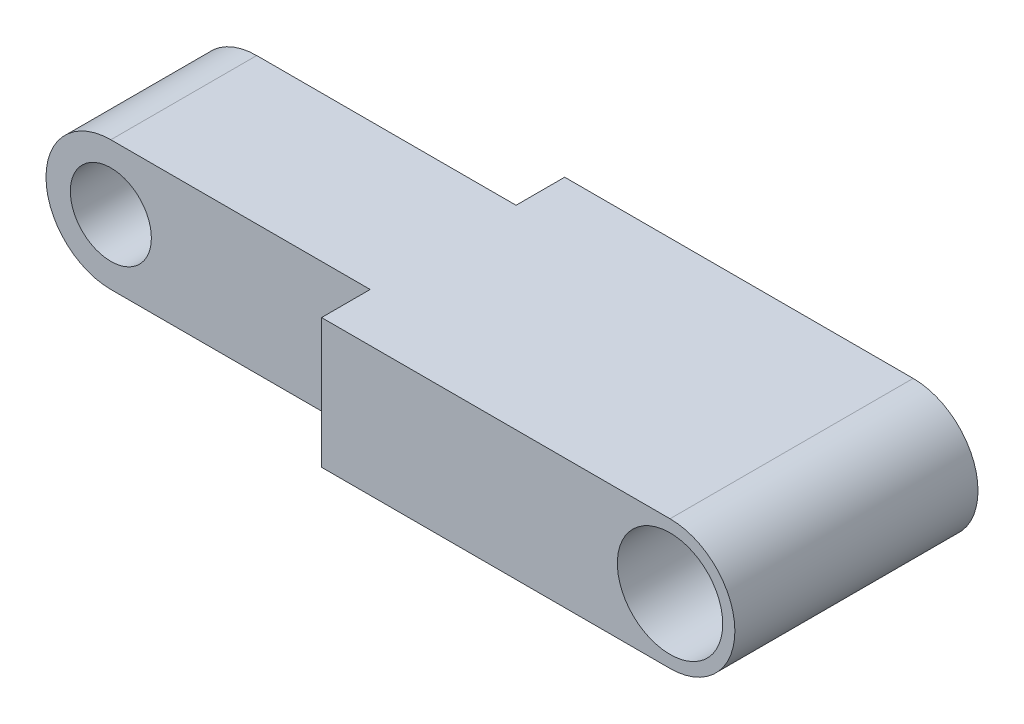
ISO-10303-21;
HEADER;
FILE_DESCRIPTION(('STEP AP214'),'2;1');
FILE_NAME('part.step','',(''),(''),'','','');
FILE_SCHEMA(('AUTOMOTIVE_DESIGN { 1 0 10303 214 1 1 1 1 }'));
ENDSEC;
DATA;
#1=APPLICATION_CONTEXT('core data for automotive mechanical design processes');
#2=APPLICATION_PROTOCOL_DEFINITION('international standard','automotive_design',2000,#1);
#3=PRODUCT_CONTEXT('',#1,'mechanical');
#4=PRODUCT('Part','Part','',(#3));
#5=PRODUCT_RELATED_PRODUCT_CATEGORY('part','',(#4));
#6=PRODUCT_DEFINITION_FORMATION('','',#4);
#7=PRODUCT_DEFINITION_CONTEXT('part definition',#1,'design');
#8=PRODUCT_DEFINITION('design','',#6,#7);
#9=PRODUCT_DEFINITION_SHAPE('','',#8);
#10=(LENGTH_UNIT() NAMED_UNIT(*) SI_UNIT(.MILLI.,.METRE.));
#11=(NAMED_UNIT(*) PLANE_ANGLE_UNIT() SI_UNIT($,.RADIAN.));
#12=(NAMED_UNIT(*) SI_UNIT($,.STERADIAN.) SOLID_ANGLE_UNIT());
#13=UNCERTAINTY_MEASURE_WITH_UNIT(LENGTH_MEASURE(1.E-05),#10,'distance_accuracy_value','');
#14=(GEOMETRIC_REPRESENTATION_CONTEXT(3) GLOBAL_UNCERTAINTY_ASSIGNED_CONTEXT((#13)) GLOBAL_UNIT_ASSIGNED_CONTEXT((#10,
#11,#12)) REPRESENTATION_CONTEXT('',''));
#15=CARTESIAN_POINT('',(0.,0.,0.));
#16=DIRECTION('',(0.,0.,1.));
#17=DIRECTION('',(1.,0.,0.));
#18=AXIS2_PLACEMENT_3D('',#15,#16,#17);
#19=CARTESIAN_POINT('',(-75.,0.,60.));
#20=DIRECTION('',(0.,0.,-1.));
#21=DIRECTION('',(-1.,0.,0.));
#22=AXIS2_PLACEMENT_3D('',#19,#20,#21);
#23=CYLINDRICAL_SURFACE('',#22,16.);
#24=CARTESIAN_POINT('',(-75.,0.,12.));
#25=DIRECTION('',(0.,0.,1.));
#26=DIRECTION('',(1.,0.,0.));
#27=AXIS2_PLACEMENT_3D('',#24,#25,#26);
#28=CIRCLE('',#27,16.);
#29=CARTESIAN_POINT('',(-75.,16.,12.));
#30=VERTEX_POINT('',#29);
#31=CARTESIAN_POINT('',(-75.,-16.,12.));
#32=VERTEX_POINT('',#31);
#33=EDGE_CURVE('E113',#30,#32,#28,.T.);
#34=ORIENTED_EDGE('',*,*,#33,.T.);
#35=DIRECTION('',(0.,0.,-1.));
#36=VECTOR('',#35,1.);
#37=CARTESIAN_POINT('',(-75.,-16.,60.));
#38=LINE('',#37,#36);
#39=CARTESIAN_POINT('',(-75.,-16.,48.));
#40=VERTEX_POINT('',#39);
#41=EDGE_CURVE('E11',#40,#32,#38,.T.);
#42=ORIENTED_EDGE('',*,*,#41,.F.);
#43=CARTESIAN_POINT('',(-75.,0.,48.));
#44=DIRECTION('',(0.,0.,1.));
#45=DIRECTION('',(1.,0.,0.));
#46=AXIS2_PLACEMENT_3D('',#43,#44,#45);
#47=CIRCLE('',#46,16.);
#48=CARTESIAN_POINT('',(-75.,16.,48.));
#49=VERTEX_POINT('',#48);
#50=EDGE_CURVE('E135',#49,#40,#47,.T.);
#51=ORIENTED_EDGE('',*,*,#50,.F.);
#52=DIRECTION('',(0.,0.,-1.));
#53=VECTOR('',#52,1.);
#54=CARTESIAN_POINT('',(-75.,16.,60.));
#55=LINE('',#54,#53);
#56=EDGE_CURVE('E167',#49,#30,#55,.T.);
#57=ORIENTED_EDGE('',*,*,#56,.T.);
#58=EDGE_LOOP('',(#34,#42,#51,#57));
#59=FACE_BOUND('',#58,.T.);
#60=ADVANCED_FACE('F35',(#59),#23,.T.);
#61=CARTESIAN_POINT('',(-75.,0.,-0.001000000000001));
#62=DIRECTION('',(0.,0.,1.));
#63=DIRECTION('',(1.,0.,0.));
#64=AXIS2_PLACEMENT_3D('',#61,#62,#63);
#65=CYLINDRICAL_SURFACE('',#64,9.99999999999999);
#66=CARTESIAN_POINT('',(-75.,0.,48.));
#67=DIRECTION('',(0.,0.,1.));
#68=DIRECTION('',(1.,0.,0.));
#69=AXIS2_PLACEMENT_3D('',#66,#67,#68);
#70=CIRCLE('',#69,9.99999999999999);
#71=CARTESIAN_POINT('',(-65.,0.,48.));
#72=VERTEX_POINT('',#71);
#73=EDGE_CURVE('E38',#72,#72,#70,.F.);
#74=ORIENTED_EDGE('',*,*,#73,.F.);
#75=EDGE_LOOP('',(#74));
#76=FACE_BOUND('',#75,.T.);
#77=CARTESIAN_POINT('',(-75.,0.,12.));
#78=DIRECTION('',(0.,0.,-1.));
#79=DIRECTION('',(-1.,0.,0.));
#80=AXIS2_PLACEMENT_3D('',#77,#78,#79);
#81=CIRCLE('',#80,9.99999999999999);
#82=CARTESIAN_POINT('',(-85.,0.,12.));
#83=VERTEX_POINT('',#82);
#84=EDGE_CURVE('E125',#83,#83,#81,.F.);
#85=ORIENTED_EDGE('',*,*,#84,.F.);
#86=EDGE_LOOP('',(#85));
#87=FACE_BOUND('',#86,.T.);
#88=ADVANCED_FACE('F219',(#76,#87),#65,.F.);
#89=CARTESIAN_POINT('',(-75.,-16.,60.));
#90=DIRECTION('',(0.,1.,0.));
#91=DIRECTION('',(-1.,0.,0.));
#92=AXIS2_PLACEMENT_3D('',#89,#90,#91);
#93=PLANE('',#92);
#94=DIRECTION('',(0.,0.,-1.));
#95=VECTOR('',#94,1.);
#96=CARTESIAN_POINT('',(-11.,-16.,12.));
#97=LINE('',#96,#95);
#98=CARTESIAN_POINT('',(-11.,-16.,12.));
#99=VERTEX_POINT('',#98);
#100=CARTESIAN_POINT('',(-11.,-16.,0.));
#101=VERTEX_POINT('',#100);
#102=EDGE_CURVE('E103',#99,#101,#97,.T.);
#103=ORIENTED_EDGE('',*,*,#102,.T.);
#104=DIRECTION('',(1.,0.,0.));
#105=VECTOR('',#104,1.);
#106=CARTESIAN_POINT('',(-75.,-16.,0.));
#107=LINE('',#106,#105);
#108=CARTESIAN_POINT('',(75.,-16.,0.));
#109=VERTEX_POINT('',#108);
#110=EDGE_CURVE('E157',#101,#109,#107,.T.);
#111=ORIENTED_EDGE('',*,*,#110,.T.);
#112=DIRECTION('',(0.,0.,-1.));
#113=VECTOR('',#112,1.);
#114=CARTESIAN_POINT('',(75.,-16.,60.));
#115=LINE('',#114,#113);
#116=CARTESIAN_POINT('',(75.,-16.,60.));
#117=VERTEX_POINT('',#116);
#118=EDGE_CURVE('E43',#117,#109,#115,.T.);
#119=ORIENTED_EDGE('',*,*,#118,.F.);
#120=DIRECTION('',(1.,0.,0.));
#121=VECTOR('',#120,1.);
#122=CARTESIAN_POINT('',(-75.,-16.,60.));
#123=LINE('',#122,#121);
#124=CARTESIAN_POINT('',(-11.,-16.,60.));
#125=VERTEX_POINT('',#124);
#126=EDGE_CURVE('E160',#125,#117,#123,.T.);
#127=ORIENTED_EDGE('',*,*,#126,.F.);
#128=DIRECTION('',(0.,0.,1.));
#129=VECTOR('',#128,1.);
#130=CARTESIAN_POINT('',(-11.,-16.,48.));
#131=LINE('',#130,#129);
#132=CARTESIAN_POINT('',(-11.,-16.,48.));
#133=VERTEX_POINT('',#132);
#134=EDGE_CURVE('E58',#133,#125,#131,.T.);
#135=ORIENTED_EDGE('',*,*,#134,.F.);
#136=DIRECTION('',(1.,0.,0.));
#137=VECTOR('',#136,1.);
#138=CARTESIAN_POINT('',(-75.,-16.,48.));
#139=LINE('',#138,#137);
#140=EDGE_CURVE('E137',#40,#133,#139,.T.);
#141=ORIENTED_EDGE('',*,*,#140,.F.);
#142=ORIENTED_EDGE('',*,*,#41,.T.);
#143=DIRECTION('',(1.,0.,0.));
#144=VECTOR('',#143,1.);
#145=CARTESIAN_POINT('',(-75.,-16.,12.));
#146=LINE('',#145,#144);
#147=EDGE_CURVE('E106',#32,#99,#146,.T.);
#148=ORIENTED_EDGE('',*,*,#147,.T.);
#149=EDGE_LOOP('',(#103,#111,#119,#127,#135,#141,#142,#148));
#150=FACE_BOUND('',#149,.T.);
#151=ADVANCED_FACE('F188',(#150),#93,.F.);
#152=CARTESIAN_POINT('',(-75.,16.,60.));
#153=DIRECTION('',(0.,-1.,0.));
#154=DIRECTION('',(1.,0.,0.));
#155=AXIS2_PLACEMENT_3D('',#152,#153,#154);
#156=PLANE('',#155);
#157=DIRECTION('',(0.,0.,-1.));
#158=VECTOR('',#157,1.);
#159=CARTESIAN_POINT('',(-11.,16.,12.));
#160=LINE('',#159,#158);
#161=CARTESIAN_POINT('',(-11.,16.,12.));
#162=VERTEX_POINT('',#161);
#163=CARTESIAN_POINT('',(-11.,16.,0.));
#164=VERTEX_POINT('',#163);
#165=EDGE_CURVE('E50',#162,#164,#160,.T.);
#166=ORIENTED_EDGE('',*,*,#165,.F.);
#167=DIRECTION('',(-1.,0.,0.));
#168=VECTOR('',#167,1.);
#169=CARTESIAN_POINT('',(-11.,16.,12.));
#170=LINE('',#169,#168);
#171=EDGE_CURVE('E107',#162,#30,#170,.T.);
#172=ORIENTED_EDGE('',*,*,#171,.T.);
#173=ORIENTED_EDGE('',*,*,#56,.F.);
#174=DIRECTION('',(-1.,0.,0.));
#175=VECTOR('',#174,1.);
#176=CARTESIAN_POINT('',(-11.,16.,48.));
#177=LINE('',#176,#175);
#178=CARTESIAN_POINT('',(-11.,16.,48.));
#179=VERTEX_POINT('',#178);
#180=EDGE_CURVE('E133',#179,#49,#177,.T.);
#181=ORIENTED_EDGE('',*,*,#180,.F.);
#182=DIRECTION('',(0.,0.,1.));
#183=VECTOR('',#182,1.);
#184=CARTESIAN_POINT('',(-11.,16.,48.));
#185=LINE('',#184,#183);
#186=CARTESIAN_POINT('',(-11.,16.,60.));
#187=VERTEX_POINT('',#186);
#188=EDGE_CURVE('E143',#179,#187,#185,.T.);
#189=ORIENTED_EDGE('',*,*,#188,.T.);
#190=DIRECTION('',(-1.,0.,0.));
#191=VECTOR('',#190,1.);
#192=CARTESIAN_POINT('',(-75.,16.,60.));
#193=LINE('',#192,#191);
#194=CARTESIAN_POINT('',(75.,16.,60.));
#195=VERTEX_POINT('',#194);
#196=EDGE_CURVE('E164',#195,#187,#193,.T.);
#197=ORIENTED_EDGE('',*,*,#196,.F.);
#198=DIRECTION('',(0.,0.,-1.));
#199=VECTOR('',#198,1.);
#200=CARTESIAN_POINT('',(75.,16.,60.));
#201=LINE('',#200,#199);
#202=CARTESIAN_POINT('',(75.,16.,0.));
#203=VERTEX_POINT('',#202);
#204=EDGE_CURVE('E173',#195,#203,#201,.T.);
#205=ORIENTED_EDGE('',*,*,#204,.T.);
#206=DIRECTION('',(-1.,0.,0.));
#207=VECTOR('',#206,1.);
#208=CARTESIAN_POINT('',(-75.,16.,0.));
#209=LINE('',#208,#207);
#210=EDGE_CURVE('E123',#203,#164,#209,.T.);
#211=ORIENTED_EDGE('',*,*,#210,.T.);
#212=EDGE_LOOP('',(#166,#172,#173,#181,#189,#197,#205,#211));
#213=FACE_BOUND('',#212,.T.);
#214=ADVANCED_FACE('F120',(#213),#156,.F.);
#215=CARTESIAN_POINT('',(-75.,0.,0.));
#216=DIRECTION('',(0.,0.,1.));
#217=DIRECTION('',(1.,0.,0.));
#218=AXIS2_PLACEMENT_3D('',#215,#216,#217);
#219=PLANE('',#218);
#220=CARTESIAN_POINT('',(75.,0.,0.));
#221=DIRECTION('',(0.,0.,1.));
#222=DIRECTION('',(1.,0.,0.));
#223=AXIS2_PLACEMENT_3D('',#220,#221,#222);
#224=CIRCLE('',#223,8.25);
#225=CARTESIAN_POINT('',(83.25,0.,0.));
#226=VERTEX_POINT('',#225);
#227=EDGE_CURVE('E150',#226,#226,#224,.F.);
#228=ORIENTED_EDGE('',*,*,#227,.F.);
#229=EDGE_LOOP('',(#228));
#230=FACE_BOUND('',#229,.T.);
#231=DIRECTION('',(0.,1.,0.));
#232=VECTOR('',#231,1.);
#233=CARTESIAN_POINT('',(-11.,16.,0.));
#234=LINE('',#233,#232);
#235=EDGE_CURVE('E117',#101,#164,#234,.T.);
#236=ORIENTED_EDGE('',*,*,#235,.T.);
#237=ORIENTED_EDGE('',*,*,#210,.F.);
#238=CARTESIAN_POINT('',(75.,0.,0.));
#239=DIRECTION('',(0.,0.,1.));
#240=DIRECTION('',(1.,0.,0.));
#241=AXIS2_PLACEMENT_3D('',#238,#239,#240);
#242=CIRCLE('',#241,16.);
#243=EDGE_CURVE('E169',#109,#203,#242,.T.);
#244=ORIENTED_EDGE('',*,*,#243,.F.);
#245=ORIENTED_EDGE('',*,*,#110,.F.);
#246=EDGE_LOOP('',(#236,#237,#244,#245));
#247=FACE_BOUND('',#246,.T.);
#248=ADVANCED_FACE('F186',(#230,#247),#219,.F.);
#249=CARTESIAN_POINT('',(75.,0.,60.));
#250=DIRECTION('',(0.,0.,-1.));
#251=DIRECTION('',(-1.,0.,0.));
#252=AXIS2_PLACEMENT_3D('',#249,#250,#251);
#253=CYLINDRICAL_SURFACE('',#252,16.);
#254=ORIENTED_EDGE('',*,*,#243,.T.);
#255=ORIENTED_EDGE('',*,*,#204,.F.);
#256=CARTESIAN_POINT('',(75.,0.,60.));
#257=DIRECTION('',(0.,0.,1.));
#258=DIRECTION('',(1.,0.,0.));
#259=AXIS2_PLACEMENT_3D('',#256,#257,#258);
#260=CIRCLE('',#259,16.);
#261=EDGE_CURVE('E162',#117,#195,#260,.T.);
#262=ORIENTED_EDGE('',*,*,#261,.F.);
#263=ORIENTED_EDGE('',*,*,#118,.T.);
#264=EDGE_LOOP('',(#254,#255,#262,#263));
#265=FACE_BOUND('',#264,.T.);
#266=ADVANCED_FACE('F180',(#265),#253,.T.);
#267=CARTESIAN_POINT('',(-75.,0.,60.));
#268=DIRECTION('',(0.,0.,1.));
#269=DIRECTION('',(1.,0.,0.));
#270=AXIS2_PLACEMENT_3D('',#267,#268,#269);
#271=PLANE('',#270);
#272=DIRECTION('',(0.,1.,0.));
#273=VECTOR('',#272,1.);
#274=CARTESIAN_POINT('',(-11.,16.,60.));
#275=LINE('',#274,#273);
#276=EDGE_CURVE('E132',#125,#187,#275,.T.);
#277=ORIENTED_EDGE('',*,*,#276,.F.);
#278=ORIENTED_EDGE('',*,*,#126,.T.);
#279=ORIENTED_EDGE('',*,*,#261,.T.);
#280=ORIENTED_EDGE('',*,*,#196,.T.);
#281=EDGE_LOOP('',(#277,#278,#279,#280));
#282=FACE_BOUND('',#281,.T.);
#283=CARTESIAN_POINT('',(75.,0.,60.));
#284=DIRECTION('',(0.,0.,1.));
#285=DIRECTION('',(1.,0.,0.));
#286=AXIS2_PLACEMENT_3D('',#283,#284,#285);
#287=CIRCLE('',#286,13.);
#288=CARTESIAN_POINT('',(88.,0.,60.));
#289=VERTEX_POINT('',#288);
#290=EDGE_CURVE('E153',#289,#289,#287,.T.);
#291=ORIENTED_EDGE('',*,*,#290,.F.);
#292=EDGE_LOOP('',(#291));
#293=FACE_BOUND('',#292,.T.);
#294=ADVANCED_FACE('F200',(#282,#293),#271,.T.);
#295=CARTESIAN_POINT('',(75.,0.,35.));
#296=DIRECTION('',(0.,0.,1.));
#297=DIRECTION('',(1.,0.,0.));
#298=AXIS2_PLACEMENT_3D('',#295,#296,#297);
#299=CYLINDRICAL_SURFACE('',#298,13.);
#300=CARTESIAN_POINT('',(75.,0.,35.));
#301=DIRECTION('',(0.,0.,1.));
#302=DIRECTION('',(1.,0.,0.));
#303=AXIS2_PLACEMENT_3D('',#300,#301,#302);
#304=CIRCLE('',#303,13.);
#305=CARTESIAN_POINT('',(88.,0.,35.));
#306=VERTEX_POINT('',#305);
#307=EDGE_CURVE('E154',#306,#306,#304,.T.);
#308=ORIENTED_EDGE('',*,*,#307,.F.);
#309=EDGE_LOOP('',(#308));
#310=FACE_BOUND('',#309,.T.);
#311=ORIENTED_EDGE('',*,*,#290,.T.);
#312=EDGE_LOOP('',(#311));
#313=FACE_BOUND('',#312,.T.);
#314=ADVANCED_FACE('F203',(#310,#313),#299,.F.);
#315=CARTESIAN_POINT('',(75.,0.,35.));
#316=DIRECTION('',(0.,0.,1.));
#317=DIRECTION('',(1.,0.,0.));
#318=AXIS2_PLACEMENT_3D('',#315,#316,#317);
#319=PLANE('',#318);
#320=CARTESIAN_POINT('',(75.,0.,35.));
#321=DIRECTION('',(0.,0.,1.));
#322=DIRECTION('',(1.,0.,0.));
#323=AXIS2_PLACEMENT_3D('',#320,#321,#322);
#324=CIRCLE('',#323,8.25);
#325=CARTESIAN_POINT('',(83.25,0.,35.));
#326=VERTEX_POINT('',#325);
#327=EDGE_CURVE('E147',#326,#326,#324,.T.);
#328=ORIENTED_EDGE('',*,*,#327,.F.);
#329=EDGE_LOOP('',(#328));
#330=FACE_BOUND('',#329,.T.);
#331=ORIENTED_EDGE('',*,*,#307,.T.);
#332=EDGE_LOOP('',(#331));
#333=FACE_BOUND('',#332,.T.);
#334=ADVANCED_FACE('F208',(#330,#333),#319,.T.);
#335=CARTESIAN_POINT('',(75.,0.,-0.001000000000001));
#336=DIRECTION('',(0.,0.,1.));
#337=DIRECTION('',(1.,0.,0.));
#338=AXIS2_PLACEMENT_3D('',#335,#336,#337);
#339=CYLINDRICAL_SURFACE('',#338,8.25);
#340=ORIENTED_EDGE('',*,*,#327,.T.);
#341=EDGE_LOOP('',(#340));
#342=FACE_BOUND('',#341,.T.);
#343=ORIENTED_EDGE('',*,*,#227,.T.);
#344=EDGE_LOOP('',(#343));
#345=FACE_BOUND('',#344,.T.);
#346=ADVANCED_FACE('F214',(#342,#345),#339,.F.);
#347=CARTESIAN_POINT('',(-75.,0.,48.));
#348=DIRECTION('',(0.,0.,1.));
#349=DIRECTION('',(1.,0.,0.));
#350=AXIS2_PLACEMENT_3D('',#347,#348,#349);
#351=PLANE('',#350);
#352=ORIENTED_EDGE('',*,*,#180,.T.);
#353=ORIENTED_EDGE('',*,*,#50,.T.);
#354=ORIENTED_EDGE('',*,*,#140,.T.);
#355=DIRECTION('',(0.,1.,0.));
#356=VECTOR('',#355,1.);
#357=CARTESIAN_POINT('',(-11.,16.,48.));
#358=LINE('',#357,#356);
#359=EDGE_CURVE('E139',#133,#179,#358,.T.);
#360=ORIENTED_EDGE('',*,*,#359,.T.);
#361=EDGE_LOOP('',(#352,#353,#354,#360));
#362=FACE_BOUND('',#361,.T.);
#363=ORIENTED_EDGE('',*,*,#73,.T.);
#364=EDGE_LOOP('',(#363));
#365=FACE_BOUND('',#364,.T.);
#366=ADVANCED_FACE('F196',(#362,#365),#351,.T.);
#367=CARTESIAN_POINT('',(-11.,16.,48.));
#368=DIRECTION('',(1.,0.,0.));
#369=DIRECTION('',(0.,0.,-1.));
#370=AXIS2_PLACEMENT_3D('',#367,#368,#369);
#371=PLANE('',#370);
#372=ORIENTED_EDGE('',*,*,#276,.T.);
#373=ORIENTED_EDGE('',*,*,#188,.F.);
#374=ORIENTED_EDGE('',*,*,#359,.F.);
#375=ORIENTED_EDGE('',*,*,#134,.T.);
#376=EDGE_LOOP('',(#372,#373,#374,#375));
#377=FACE_BOUND('',#376,.T.);
#378=ADVANCED_FACE('F198',(#377),#371,.F.);
#379=CARTESIAN_POINT('',(-75.,0.,12.));
#380=DIRECTION('',(0.,0.,-1.));
#381=DIRECTION('',(1.,0.,0.));
#382=AXIS2_PLACEMENT_3D('',#379,#380,#381);
#383=PLANE('',#382);
#384=ORIENTED_EDGE('',*,*,#171,.F.);
#385=DIRECTION('',(0.,1.,0.));
#386=VECTOR('',#385,1.);
#387=CARTESIAN_POINT('',(-11.,16.,12.));
#388=LINE('',#387,#386);
#389=EDGE_CURVE('E99',#99,#162,#388,.T.);
#390=ORIENTED_EDGE('',*,*,#389,.F.);
#391=ORIENTED_EDGE('',*,*,#147,.F.);
#392=ORIENTED_EDGE('',*,*,#33,.F.);
#393=EDGE_LOOP('',(#384,#390,#391,#392));
#394=FACE_BOUND('',#393,.T.);
#395=ORIENTED_EDGE('',*,*,#84,.T.);
#396=EDGE_LOOP('',(#395));
#397=FACE_BOUND('',#396,.T.);
#398=ADVANCED_FACE('F110',(#394,#397),#383,.T.);
#399=CARTESIAN_POINT('',(-11.,16.,12.));
#400=DIRECTION('',(-1.,0.,0.));
#401=DIRECTION('',(0.,0.,1.));
#402=AXIS2_PLACEMENT_3D('',#399,#400,#401);
#403=PLANE('',#402);
#404=ORIENTED_EDGE('',*,*,#235,.F.);
#405=ORIENTED_EDGE('',*,*,#102,.F.);
#406=ORIENTED_EDGE('',*,*,#389,.T.);
#407=ORIENTED_EDGE('',*,*,#165,.T.);
#408=EDGE_LOOP('',(#404,#405,#406,#407));
#409=FACE_BOUND('',#408,.T.);
#410=ADVANCED_FACE('F101',(#409),#403,.T.);
#411=CLOSED_SHELL('',(#60,#88,#151,#214,#248,#266,#294,#314,#334,#346,#366,#378,#398,#410));
#412=MANIFOLD_SOLID_BREP('B2',#411);
#413=ADVANCED_BREP_SHAPE_REPRESENTATION('',(#18,#412),#14);
#414=SHAPE_DEFINITION_REPRESENTATION(#9,#413);
ENDSEC;
END-ISO-10303-21;
